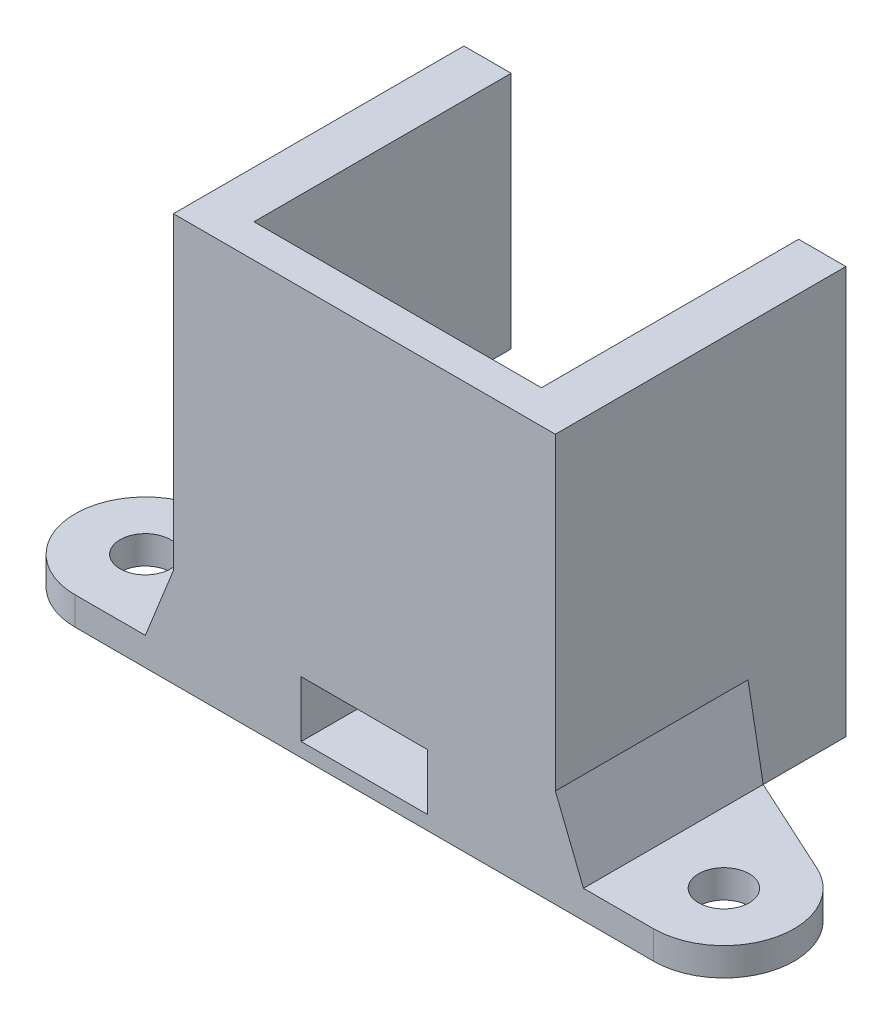
ISO-10303-21;
HEADER;
FILE_DESCRIPTION(('STEP AP214'),'2;1');
FILE_NAME('part.step','',(''),(''),'','','');
FILE_SCHEMA(('AUTOMOTIVE_DESIGN { 1 0 10303 214 1 1 1 1 }'));
ENDSEC;
DATA;
#1=APPLICATION_CONTEXT('core data for automotive mechanical design processes');
#2=APPLICATION_PROTOCOL_DEFINITION('international standard','automotive_design',2000,#1);
#3=PRODUCT_CONTEXT('',#1,'mechanical');
#4=PRODUCT('Part','Part','',(#3));
#5=PRODUCT_RELATED_PRODUCT_CATEGORY('part','',(#4));
#6=PRODUCT_DEFINITION_FORMATION('','',#4);
#7=PRODUCT_DEFINITION_CONTEXT('part definition',#1,'design');
#8=PRODUCT_DEFINITION('design','',#6,#7);
#9=PRODUCT_DEFINITION_SHAPE('','',#8);
#10=(LENGTH_UNIT() NAMED_UNIT(*) SI_UNIT(.MILLI.,.METRE.));
#11=(NAMED_UNIT(*) PLANE_ANGLE_UNIT() SI_UNIT($,.RADIAN.));
#12=(NAMED_UNIT(*) SI_UNIT($,.STERADIAN.) SOLID_ANGLE_UNIT());
#13=UNCERTAINTY_MEASURE_WITH_UNIT(LENGTH_MEASURE(1.E-05),#10,'distance_accuracy_value','');
#14=(GEOMETRIC_REPRESENTATION_CONTEXT(3) GLOBAL_UNCERTAINTY_ASSIGNED_CONTEXT((#13)) GLOBAL_UNIT_ASSIGNED_CONTEXT((#10,
#11,#12)) REPRESENTATION_CONTEXT('',''));
#15=CARTESIAN_POINT('',(0.,0.,0.));
#16=DIRECTION('',(0.,0.,1.));
#17=DIRECTION('',(1.,0.,0.));
#18=AXIS2_PLACEMENT_3D('',#15,#16,#17);
#19=CARTESIAN_POINT('',(0.,0.,0.234999999999994));
#20=DIRECTION('',(0.,0.,1.));
#21=DIRECTION('',(1.,0.,0.));
#22=AXIS2_PLACEMENT_3D('',#19,#20,#21);
#23=PLANE('',#22);
#24=DIRECTION('',(0.,-1.,0.));
#25=VECTOR('',#24,1.);
#26=CARTESIAN_POINT('',(-17.27,10.16,0.234999999999996));
#27=LINE('',#26,#25);
#28=CARTESIAN_POINT('',(-17.27,36.83,0.234999999999985));
#29=VERTEX_POINT('',#28);
#30=CARTESIAN_POINT('',(-17.27,0.,0.234999999999989));
#31=VERTEX_POINT('',#30);
#32=EDGE_CURVE('E395',#29,#31,#27,.T.);
#33=ORIENTED_EDGE('',*,*,#32,.F.);
#34=DIRECTION('',(1.,0.,0.));
#35=VECTOR('',#34,1.);
#36=CARTESIAN_POINT('',(0.,36.83,0.234999999999994));
#37=LINE('',#36,#35);
#38=CARTESIAN_POINT('',(-13.,36.83,0.234999999999985));
#39=VERTEX_POINT('',#38);
#40=EDGE_CURVE('E383',#29,#39,#37,.T.);
#41=ORIENTED_EDGE('',*,*,#40,.T.);
#42=DIRECTION('',(0.,-1.,0.));
#43=VECTOR('',#42,1.);
#44=CARTESIAN_POINT('',(-13.,36.83,0.234999999999992));
#45=LINE('',#44,#43);
#46=CARTESIAN_POINT('',(-13.,15.24,0.234999999999985));
#47=VERTEX_POINT('',#46);
#48=EDGE_CURVE('E42',#39,#47,#45,.T.);
#49=ORIENTED_EDGE('',*,*,#48,.T.);
#50=DIRECTION('',(1.,0.,0.));
#51=VECTOR('',#50,1.);
#52=CARTESIAN_POINT('',(0.,15.24,0.234999999999994));
#53=LINE('',#52,#51);
#54=CARTESIAN_POINT('',(-16.,15.24,0.234999999999992));
#55=VERTEX_POINT('',#54);
#56=EDGE_CURVE('E379',#55,#47,#53,.T.);
#57=ORIENTED_EDGE('',*,*,#56,.F.);
#58=DIRECTION('',(0.,-1.,0.));
#59=VECTOR('',#58,1.);
#60=CARTESIAN_POINT('',(-16.,15.24,0.234999999999992));
#61=LINE('',#60,#59);
#62=CARTESIAN_POINT('',(-16.,10.16,0.234999999999992));
#63=VERTEX_POINT('',#62);
#64=EDGE_CURVE('E387',#55,#63,#61,.T.);
#65=ORIENTED_EDGE('',*,*,#64,.T.);
#66=DIRECTION('',(1.,0.,0.));
#67=VECTOR('',#66,1.);
#68=CARTESIAN_POINT('',(0.,10.16,0.234999999999994));
#69=LINE('',#68,#67);
#70=CARTESIAN_POINT('',(-11.2395,10.16,0.234999999999996));
#71=VERTEX_POINT('',#70);
#72=EDGE_CURVE('E392',#63,#71,#69,.T.);
#73=ORIENTED_EDGE('',*,*,#72,.T.);
#74=DIRECTION('',(0.,-1.,0.));
#75=VECTOR('',#74,1.);
#76=CARTESIAN_POINT('',(-11.2395,10.16,0.234999999999996));
#77=LINE('',#76,#75);
#78=CARTESIAN_POINT('',(-11.2395,0.,0.234999999999996));
#79=VERTEX_POINT('',#78);
#80=EDGE_CURVE('E37',#71,#79,#77,.T.);
#81=ORIENTED_EDGE('',*,*,#80,.T.);
#82=DIRECTION('',(1.,0.,0.));
#83=VECTOR('',#82,1.);
#84=CARTESIAN_POINT('',(0.,0.,0.234999999999994));
#85=LINE('',#84,#83);
#86=EDGE_CURVE('E398',#31,#79,#85,.T.);
#87=ORIENTED_EDGE('',*,*,#86,.F.);
#88=EDGE_LOOP('',(#33,#41,#49,#57,#65,#73,#81,#87));
#89=FACE_BOUND('',#88,.T.);
#90=ADVANCED_FACE('F34',(#89),#23,.F.);
#91=DIRECTION('',(0.,1.,0.));
#92=VECTOR('',#91,1.);
#93=CARTESIAN_POINT('',(11.2395,10.16,0.234999999999996));
#94=LINE('',#93,#92);
#95=CARTESIAN_POINT('',(11.2395,0.,0.234999999999996));
#96=VERTEX_POINT('',#95);
#97=CARTESIAN_POINT('',(11.2395,10.16,0.234999999999996));
#98=VERTEX_POINT('',#97);
#99=EDGE_CURVE('E391',#96,#98,#94,.T.);
#100=ORIENTED_EDGE('',*,*,#99,.T.);
#101=CARTESIAN_POINT('',(16.,10.16,0.234999999999992));
#102=VERTEX_POINT('',#101);
#103=EDGE_CURVE('E388',#98,#102,#69,.T.);
#104=ORIENTED_EDGE('',*,*,#103,.T.);
#105=DIRECTION('',(0.,1.,0.));
#106=VECTOR('',#105,1.);
#107=CARTESIAN_POINT('',(16.,15.24,0.234999999999992));
#108=LINE('',#107,#106);
#109=CARTESIAN_POINT('',(16.,15.24,0.234999999999992));
#110=VERTEX_POINT('',#109);
#111=EDGE_CURVE('E384',#102,#110,#108,.T.);
#112=ORIENTED_EDGE('',*,*,#111,.T.);
#113=CARTESIAN_POINT('',(13.,15.24,0.234999999999985));
#114=VERTEX_POINT('',#113);
#115=EDGE_CURVE('E240',#114,#110,#53,.T.);
#116=ORIENTED_EDGE('',*,*,#115,.F.);
#117=DIRECTION('',(0.,1.,0.));
#118=VECTOR('',#117,1.);
#119=CARTESIAN_POINT('',(13.,36.83,0.234999999999992));
#120=LINE('',#119,#118);
#121=CARTESIAN_POINT('',(13.,36.83,0.234999999999985));
#122=VERTEX_POINT('',#121);
#123=EDGE_CURVE('E11',#114,#122,#120,.T.);
#124=ORIENTED_EDGE('',*,*,#123,.T.);
#125=CARTESIAN_POINT('',(17.27,36.83,0.234999999999985));
#126=VERTEX_POINT('',#125);
#127=EDGE_CURVE('E56',#122,#126,#37,.T.);
#128=ORIENTED_EDGE('',*,*,#127,.T.);
#129=DIRECTION('',(0.,1.,0.));
#130=VECTOR('',#129,1.);
#131=CARTESIAN_POINT('',(17.27,10.16,0.234999999999992));
#132=LINE('',#131,#130);
#133=CARTESIAN_POINT('',(17.27,0.,0.234999999999985));
#134=VERTEX_POINT('',#133);
#135=EDGE_CURVE('E393',#134,#126,#132,.T.);
#136=ORIENTED_EDGE('',*,*,#135,.F.);
#137=EDGE_CURVE('E381',#96,#134,#85,.T.);
#138=ORIENTED_EDGE('',*,*,#137,.F.);
#139=EDGE_LOOP('',(#100,#104,#112,#116,#124,#128,#136,#138));
#140=FACE_BOUND('',#139,.T.);
#141=ADVANCED_FACE('F485',(#140),#23,.F.);
#142=CARTESIAN_POINT('',(17.27,10.16,-26.035));
#143=DIRECTION('',(-1.,0.,0.));
#144=DIRECTION('',(0.,0.,1.));
#145=AXIS2_PLACEMENT_3D('',#142,#143,#144);
#146=PLANE('',#145);
#147=DIRECTION('',(0.,0.,-1.));
#148=VECTOR('',#147,1.);
#149=CARTESIAN_POINT('',(17.27,0.,-26.035));
#150=LINE('',#149,#148);
#151=CARTESIAN_POINT('',(17.27,0.,9.08339668340667));
#152=VERTEX_POINT('',#151);
#153=EDGE_CURVE('E359',#152,#134,#150,.T.);
#154=ORIENTED_EDGE('',*,*,#153,.T.);
#155=ORIENTED_EDGE('',*,*,#135,.T.);
#156=DIRECTION('',(0.,0.,-1.));
#157=VECTOR('',#156,1.);
#158=CARTESIAN_POINT('',(17.27,36.83,-26.035));
#159=LINE('',#158,#157);
#160=CARTESIAN_POINT('',(17.27,36.83,26.505));
#161=VERTEX_POINT('',#160);
#162=EDGE_CURVE('E311',#161,#126,#159,.T.);
#163=ORIENTED_EDGE('',*,*,#162,.F.);
#164=DIRECTION('',(0.,-1.,0.));
#165=VECTOR('',#164,1.);
#166=CARTESIAN_POINT('',(17.27,10.16,26.505));
#167=LINE('',#166,#165);
#168=CARTESIAN_POINT('',(17.27,8.89,26.505));
#169=VERTEX_POINT('',#168);
#170=EDGE_CURVE('E362',#161,#169,#167,.T.);
#171=ORIENTED_EDGE('',*,*,#170,.T.);
#172=DIRECTION('',(0.,0.,1.));
#173=VECTOR('',#172,1.);
#174=CARTESIAN_POINT('',(17.27,8.89,9.083396794));
#175=LINE('',#174,#173);
#176=CARTESIAN_POINT('',(17.27,8.89,9.083396794));
#177=VERTEX_POINT('',#176);
#178=EDGE_CURVE('E427',#177,#169,#175,.T.);
#179=ORIENTED_EDGE('',*,*,#178,.F.);
#180=DIRECTION('',(0.,-1.,0.));
#181=VECTOR('',#180,1.);
#182=CARTESIAN_POINT('',(17.27,2.54,9.08339668340669));
#183=LINE('',#182,#181);
#184=EDGE_CURVE('E457',#177,#152,#183,.T.);
#185=ORIENTED_EDGE('',*,*,#184,.T.);
#186=EDGE_LOOP('',(#154,#155,#163,#171,#179,#185));
#187=FACE_BOUND('',#186,.T.);
#188=ADVANCED_FACE('F489',(#187),#146,.F.);
#189=CARTESIAN_POINT('',(-17.27,8.89,9.083396794));
#190=DIRECTION('',(0.928476690885261,-0.371390676354101,0.));
#191=DIRECTION('',(0.371390676354101,0.928476690885261,0.));
#192=AXIS2_PLACEMENT_3D('',#189,#190,#191);
#193=PLANE('',#192);
#194=DIRECTION('',(0.366101243764277,0.915253109410701,-0.168171415610062));
#195=VECTOR('',#194,1.);
#196=CARTESIAN_POINT('',(-17.27,8.89,9.08339679400001));
#197=LINE('',#196,#195);
#198=CARTESIAN_POINT('',(-19.81,2.54,10.2501652847528));
#199=VERTEX_POINT('',#198);
#200=CARTESIAN_POINT('',(-17.27,8.89,9.083396794));
#201=VERTEX_POINT('',#200);
#202=EDGE_CURVE('E222',#199,#201,#197,.T.);
#203=ORIENTED_EDGE('',*,*,#202,.F.);
#204=DIRECTION('',(0.,0.,-1.));
#205=VECTOR('',#204,1.);
#206=CARTESIAN_POINT('',(-19.81,2.54,0.));
#207=LINE('',#206,#205);
#208=CARTESIAN_POINT('',(-19.81,2.54,26.505));
#209=VERTEX_POINT('',#208);
#210=EDGE_CURVE('E226',#209,#199,#207,.T.);
#211=ORIENTED_EDGE('',*,*,#210,.F.);
#212=DIRECTION('',(0.371390676354101,0.928476690885261,0.));
#213=VECTOR('',#212,1.);
#214=CARTESIAN_POINT('',(-17.27,8.89,26.505));
#215=LINE('',#214,#213);
#216=CARTESIAN_POINT('',(-17.27,8.89,26.505));
#217=VERTEX_POINT('',#216);
#218=EDGE_CURVE('E232',#209,#217,#215,.T.);
#219=ORIENTED_EDGE('',*,*,#218,.T.);
#220=DIRECTION('',(0.,0.,1.));
#221=VECTOR('',#220,1.);
#222=CARTESIAN_POINT('',(-17.27,8.89,9.083396794));
#223=LINE('',#222,#221);
#224=EDGE_CURVE('E228',#201,#217,#223,.T.);
#225=ORIENTED_EDGE('',*,*,#224,.F.);
#226=EDGE_LOOP('',(#203,#211,#219,#225));
#227=FACE_BOUND('',#226,.T.);
#228=ADVANCED_FACE('F224',(#227),#193,.F.);
#229=CARTESIAN_POINT('',(-17.27,10.16,-26.035));
#230=DIRECTION('',(1.,0.,0.));
#231=DIRECTION('',(0.,0.,-1.));
#232=AXIS2_PLACEMENT_3D('',#229,#230,#231);
#233=PLANE('',#232);
#234=DIRECTION('',(0.,0.,1.));
#235=VECTOR('',#234,1.);
#236=CARTESIAN_POINT('',(-17.27,36.83,-26.035));
#237=LINE('',#236,#235);
#238=CARTESIAN_POINT('',(-17.27,36.83,26.505));
#239=VERTEX_POINT('',#238);
#240=EDGE_CURVE('E306',#29,#239,#237,.T.);
#241=ORIENTED_EDGE('',*,*,#240,.F.);
#242=ORIENTED_EDGE('',*,*,#32,.T.);
#243=DIRECTION('',(0.,0.,1.));
#244=VECTOR('',#243,1.);
#245=CARTESIAN_POINT('',(-17.27,0.,-26.035));
#246=LINE('',#245,#244);
#247=CARTESIAN_POINT('',(-17.27,0.,9.08339668340668));
#248=VERTEX_POINT('',#247);
#249=EDGE_CURVE('E355',#31,#248,#246,.T.);
#250=ORIENTED_EDGE('',*,*,#249,.T.);
#251=DIRECTION('',(0.,-1.,0.));
#252=VECTOR('',#251,1.);
#253=CARTESIAN_POINT('',(-17.27,2.54,9.08339668340669));
#254=LINE('',#253,#252);
#255=EDGE_CURVE('E259',#201,#248,#254,.T.);
#256=ORIENTED_EDGE('',*,*,#255,.F.);
#257=ORIENTED_EDGE('',*,*,#224,.T.);
#258=DIRECTION('',(0.,-1.,0.));
#259=VECTOR('',#258,1.);
#260=CARTESIAN_POINT('',(-17.27,10.16,26.505));
#261=LINE('',#260,#259);
#262=EDGE_CURVE('E365',#239,#217,#261,.T.);
#263=ORIENTED_EDGE('',*,*,#262,.F.);
#264=EDGE_LOOP('',(#241,#242,#250,#256,#257,#263));
#265=FACE_BOUND('',#264,.T.);
#266=ADVANCED_FACE('F408',(#265),#233,.F.);
#267=CARTESIAN_POINT('',(0.,2.54,0.));
#268=DIRECTION('',(0.,1.,0.));
#269=DIRECTION('',(0.,0.,1.));
#270=AXIS2_PLACEMENT_3D('',#267,#268,#269);
#271=PLANE('',#270);
#272=CARTESIAN_POINT('',(-26.16,2.54,20.155));
#273=DIRECTION('',(0.,1.,0.));
#274=DIRECTION('',(0.,0.,1.));
#275=AXIS2_PLACEMENT_3D('',#272,#273,#274);
#276=CIRCLE('',#275,2.286);
#277=CARTESIAN_POINT('',(-26.16,2.54,22.441));
#278=VERTEX_POINT('',#277);
#279=EDGE_CURVE('E429',#278,#278,#276,.T.);
#280=ORIENTED_EDGE('',*,*,#279,.F.);
#281=EDGE_LOOP('',(#280));
#282=FACE_BOUND('',#281,.T.);
#283=DIRECTION('',(1.,0.,0.));
#284=VECTOR('',#283,1.);
#285=CARTESIAN_POINT('',(0.,2.54,26.5049999999999));
#286=LINE('',#285,#284);
#287=CARTESIAN_POINT('',(-26.16,2.54,26.505));
#288=VERTEX_POINT('',#287);
#289=EDGE_CURVE('E239',#288,#209,#286,.T.);
#290=ORIENTED_EDGE('',*,*,#289,.T.);
#291=ORIENTED_EDGE('',*,*,#210,.T.);
#292=DIRECTION('',(0.908711915483254,0.,-0.417423830966509));
#293=VECTOR('',#292,1.);
#294=CARTESIAN_POINT('',(0.436325299004207,2.54,0.949859516438888));
#295=LINE('',#294,#293);
#296=CARTESIAN_POINT('',(-28.8106413266373,2.54,14.3846793366814));
#297=VERTEX_POINT('',#296);
#298=EDGE_CURVE('E237',#297,#199,#295,.T.);
#299=ORIENTED_EDGE('',*,*,#298,.F.);
#300=CARTESIAN_POINT('',(-26.16,2.54,20.155));
#301=DIRECTION('',(0.,1.,0.));
#302=DIRECTION('',(0.,0.,1.));
#303=AXIS2_PLACEMENT_3D('',#300,#301,#302);
#304=CIRCLE('',#303,6.34999999999999);
#305=EDGE_CURVE('E247',#297,#288,#304,.T.);
#306=ORIENTED_EDGE('',*,*,#305,.T.);
#307=EDGE_LOOP('',(#290,#291,#299,#306));
#308=FACE_BOUND('',#307,.T.);
#309=ADVANCED_FACE('F236',(#282,#308),#271,.T.);
#310=CARTESIAN_POINT('',(0.,10.16,0.));
#311=DIRECTION('',(0.,1.,0.));
#312=DIRECTION('',(0.,0.,1.));
#313=AXIS2_PLACEMENT_3D('',#310,#311,#312);
#314=PLANE('',#313);
#315=ORIENTED_EDGE('',*,*,#72,.F.);
#316=DIRECTION('',(0.,0.,1.));
#317=VECTOR('',#316,1.);
#318=CARTESIAN_POINT('',(-16.,10.16,-24.765));
#319=LINE('',#318,#317);
#320=CARTESIAN_POINT('',(-16.,10.16,25.235));
#321=VERTEX_POINT('',#320);
#322=EDGE_CURVE('E313',#63,#321,#319,.T.);
#323=ORIENTED_EDGE('',*,*,#322,.T.);
#324=DIRECTION('',(1.,0.,0.));
#325=VECTOR('',#324,1.);
#326=CARTESIAN_POINT('',(-16.,10.16,25.235));
#327=LINE('',#326,#325);
#328=CARTESIAN_POINT('',(16.,10.16,25.235));
#329=VERTEX_POINT('',#328);
#330=EDGE_CURVE('E325',#321,#329,#327,.T.);
#331=ORIENTED_EDGE('',*,*,#330,.T.);
#332=DIRECTION('',(0.,0.,-1.));
#333=VECTOR('',#332,1.);
#334=CARTESIAN_POINT('',(16.,10.16,-24.765));
#335=LINE('',#334,#333);
#336=EDGE_CURVE('E317',#329,#102,#335,.T.);
#337=ORIENTED_EDGE('',*,*,#336,.T.);
#338=ORIENTED_EDGE('',*,*,#103,.F.);
#339=DIRECTION('',(0.,0.,-1.));
#340=VECTOR('',#339,1.);
#341=CARTESIAN_POINT('',(11.2395,10.16,19.05));
#342=LINE('',#341,#340);
#343=CARTESIAN_POINT('',(11.2395,10.16,19.05));
#344=VERTEX_POINT('',#343);
#345=EDGE_CURVE('E335',#344,#98,#342,.T.);
#346=ORIENTED_EDGE('',*,*,#345,.F.);
#347=DIRECTION('',(1.,0.,0.));
#348=VECTOR('',#347,1.);
#349=CARTESIAN_POINT('',(-11.2395,10.16,19.05));
#350=LINE('',#349,#348);
#351=CARTESIAN_POINT('',(-11.2395,10.16,19.05));
#352=VERTEX_POINT('',#351);
#353=EDGE_CURVE('E341',#352,#344,#350,.T.);
#354=ORIENTED_EDGE('',*,*,#353,.F.);
#355=DIRECTION('',(0.,0.,1.));
#356=VECTOR('',#355,1.);
#357=CARTESIAN_POINT('',(-11.2395,10.16,19.05));
#358=LINE('',#357,#356);
#359=EDGE_CURVE('E338',#71,#352,#358,.T.);
#360=ORIENTED_EDGE('',*,*,#359,.F.);
#361=EDGE_LOOP('',(#315,#323,#331,#337,#338,#346,#354,#360));
#362=FACE_BOUND('',#361,.T.);
#363=ADVANCED_FACE('F518',(#362),#314,.T.);
#364=CARTESIAN_POINT('',(0.,0.,0.));
#365=DIRECTION('',(0.,1.,0.));
#366=DIRECTION('',(0.,0.,1.));
#367=AXIS2_PLACEMENT_3D('',#364,#365,#366);
#368=PLANE('',#367);
#369=CARTESIAN_POINT('',(26.16,0.,20.155));
#370=DIRECTION('',(0.,1.,0.));
#371=DIRECTION('',(0.,0.,1.));
#372=AXIS2_PLACEMENT_3D('',#369,#370,#371);
#373=CIRCLE('',#372,2.286);
#374=CARTESIAN_POINT('',(26.16,0.,22.441));
#375=VERTEX_POINT('',#374);
#376=EDGE_CURVE('E433',#375,#375,#373,.F.);
#377=ORIENTED_EDGE('',*,*,#376,.F.);
#378=EDGE_LOOP('',(#377));
#379=FACE_BOUND('',#378,.T.);
#380=CARTESIAN_POINT('',(-26.16,0.,20.155));
#381=DIRECTION('',(0.,1.,0.));
#382=DIRECTION('',(0.,0.,1.));
#383=AXIS2_PLACEMENT_3D('',#380,#381,#382);
#384=CIRCLE('',#383,2.286);
#385=CARTESIAN_POINT('',(-26.16,0.,22.441));
#386=VERTEX_POINT('',#385);
#387=EDGE_CURVE('E434',#386,#386,#384,.F.);
#388=ORIENTED_EDGE('',*,*,#387,.F.);
#389=EDGE_LOOP('',(#388));
#390=FACE_BOUND('',#389,.T.);
#391=ORIENTED_EDGE('',*,*,#249,.F.);
#392=ORIENTED_EDGE('',*,*,#86,.T.);
#393=DIRECTION('',(0.,0.,1.));
#394=VECTOR('',#393,1.);
#395=CARTESIAN_POINT('',(-11.2395,0.,19.05));
#396=LINE('',#395,#394);
#397=CARTESIAN_POINT('',(-11.2395,0.,19.05));
#398=VERTEX_POINT('',#397);
#399=EDGE_CURVE('E346',#79,#398,#396,.T.);
#400=ORIENTED_EDGE('',*,*,#399,.T.);
#401=DIRECTION('',(1.,0.,0.));
#402=VECTOR('',#401,1.);
#403=CARTESIAN_POINT('',(-11.2395,0.,19.05));
#404=LINE('',#403,#402);
#405=CARTESIAN_POINT('',(11.2395,0.,19.05));
#406=VERTEX_POINT('',#405);
#407=EDGE_CURVE('E339',#398,#406,#404,.T.);
#408=ORIENTED_EDGE('',*,*,#407,.T.);
#409=DIRECTION('',(0.,0.,-1.));
#410=VECTOR('',#409,1.);
#411=CARTESIAN_POINT('',(11.2395,0.,19.05));
#412=LINE('',#411,#410);
#413=EDGE_CURVE('E334',#406,#96,#412,.T.);
#414=ORIENTED_EDGE('',*,*,#413,.T.);
#415=ORIENTED_EDGE('',*,*,#137,.T.);
#416=ORIENTED_EDGE('',*,*,#153,.F.);
#417=DIRECTION('',(-0.908711915483254,0.,-0.417423830966508));
#418=VECTOR('',#417,1.);
#419=CARTESIAN_POINT('',(-0.436325299004206,0.,0.949859516438887));
#420=LINE('',#419,#418);
#421=CARTESIAN_POINT('',(28.8106413266373,0.,14.3846793366813));
#422=VERTEX_POINT('',#421);
#423=EDGE_CURVE('E446',#422,#152,#420,.T.);
#424=ORIENTED_EDGE('',*,*,#423,.F.);
#425=CARTESIAN_POINT('',(26.16,0.,20.155));
#426=DIRECTION('',(0.,1.,0.));
#427=DIRECTION('',(0.,0.,1.));
#428=AXIS2_PLACEMENT_3D('',#425,#426,#427);
#429=CIRCLE('',#428,6.34999999999999);
#430=CARTESIAN_POINT('',(26.16,0.,26.505));
#431=VERTEX_POINT('',#430);
#432=EDGE_CURVE('E437',#422,#431,#429,.F.);
#433=ORIENTED_EDGE('',*,*,#432,.T.);
#434=DIRECTION('',(1.,0.,0.));
#435=VECTOR('',#434,1.);
#436=CARTESIAN_POINT('',(-17.27,0.,26.505));
#437=LINE('',#436,#435);
#438=CARTESIAN_POINT('',(-26.16,0.,26.505));
#439=VERTEX_POINT('',#438);
#440=EDGE_CURVE('E357',#439,#431,#437,.T.);
#441=ORIENTED_EDGE('',*,*,#440,.F.);
#442=CARTESIAN_POINT('',(-26.16,0.,20.155));
#443=DIRECTION('',(0.,1.,0.));
#444=DIRECTION('',(0.,0.,1.));
#445=AXIS2_PLACEMENT_3D('',#442,#443,#444);
#446=CIRCLE('',#445,6.34999999999999);
#447=CARTESIAN_POINT('',(-28.8106413266373,0.,14.3846793366814));
#448=VERTEX_POINT('',#447);
#449=EDGE_CURVE('E248',#448,#439,#446,.T.);
#450=ORIENTED_EDGE('',*,*,#449,.F.);
#451=DIRECTION('',(0.908711915483254,0.,-0.417423830966509));
#452=VECTOR('',#451,1.);
#453=CARTESIAN_POINT('',(0.436325299004207,0.,0.949859516438888));
#454=LINE('',#453,#452);
#455=EDGE_CURVE('E252',#448,#248,#454,.T.);
#456=ORIENTED_EDGE('',*,*,#455,.T.);
#457=EDGE_LOOP('',(#391,#392,#400,#408,#414,#415,#416,#424,#433,#441,#450,#456));
#458=FACE_BOUND('',#457,.T.);
#459=ADVANCED_FACE('F413',(#379,#390,#458),#368,.F.);
#460=CARTESIAN_POINT('',(-17.27,10.16,26.505));
#461=DIRECTION('',(0.,0.,-1.));
#462=DIRECTION('',(-1.,0.,0.));
#463=AXIS2_PLACEMENT_3D('',#460,#461,#462);
#464=PLANE('',#463);
#465=DIRECTION('',(1.,0.,0.));
#466=VECTOR('',#465,1.);
#467=CARTESIAN_POINT('',(-5.715,1.27,26.505));
#468=LINE('',#467,#466);
#469=CARTESIAN_POINT('',(-5.715,1.27,26.505));
#470=VERTEX_POINT('',#469);
#471=CARTESIAN_POINT('',(5.715,1.27,26.505));
#472=VERTEX_POINT('',#471);
#473=EDGE_CURVE('E269',#470,#472,#468,.T.);
#474=ORIENTED_EDGE('',*,*,#473,.F.);
#475=DIRECTION('',(0.,-1.,0.));
#476=VECTOR('',#475,1.);
#477=CARTESIAN_POINT('',(-5.715,1.27,26.505));
#478=LINE('',#477,#476);
#479=CARTESIAN_POINT('',(-5.715,6.35,26.505));
#480=VERTEX_POINT('',#479);
#481=EDGE_CURVE('E267',#480,#470,#478,.T.);
#482=ORIENTED_EDGE('',*,*,#481,.F.);
#483=DIRECTION('',(-1.,0.,0.));
#484=VECTOR('',#483,1.);
#485=CARTESIAN_POINT('',(-5.715,6.35,26.505));
#486=LINE('',#485,#484);
#487=CARTESIAN_POINT('',(5.715,6.35,26.505));
#488=VERTEX_POINT('',#487);
#489=EDGE_CURVE('E275',#488,#480,#486,.T.);
#490=ORIENTED_EDGE('',*,*,#489,.F.);
#491=DIRECTION('',(0.,1.,0.));
#492=VECTOR('',#491,1.);
#493=CARTESIAN_POINT('',(5.715,1.27,26.505));
#494=LINE('',#493,#492);
#495=EDGE_CURVE('E272',#472,#488,#494,.T.);
#496=ORIENTED_EDGE('',*,*,#495,.F.);
#497=EDGE_LOOP('',(#474,#482,#490,#496));
#498=FACE_BOUND('',#497,.T.);
#499=ORIENTED_EDGE('',*,*,#440,.T.);
#500=DIRECTION('',(0.,-1.,0.));
#501=VECTOR('',#500,1.);
#502=CARTESIAN_POINT('',(26.16,2.54,26.505));
#503=LINE('',#502,#501);
#504=CARTESIAN_POINT('',(26.16,2.54,26.505));
#505=VERTEX_POINT('',#504);
#506=EDGE_CURVE('E452',#505,#431,#503,.T.);
#507=ORIENTED_EDGE('',*,*,#506,.F.);
#508=DIRECTION('',(-1.,0.,0.));
#509=VECTOR('',#508,1.);
#510=CARTESIAN_POINT('',(0.,2.54,26.505));
#511=LINE('',#510,#509);
#512=CARTESIAN_POINT('',(19.81,2.54,26.505));
#513=VERTEX_POINT('',#512);
#514=EDGE_CURVE('E449',#505,#513,#511,.T.);
#515=ORIENTED_EDGE('',*,*,#514,.T.);
#516=DIRECTION('',(-0.371390676354101,0.928476690885261,0.));
#517=VECTOR('',#516,1.);
#518=CARTESIAN_POINT('',(17.27,8.89,26.505));
#519=LINE('',#518,#517);
#520=EDGE_CURVE('E424',#513,#169,#519,.T.);
#521=ORIENTED_EDGE('',*,*,#520,.T.);
#522=ORIENTED_EDGE('',*,*,#170,.F.);
#523=DIRECTION('',(1.,0.,0.));
#524=VECTOR('',#523,1.);
#525=CARTESIAN_POINT('',(-17.27,36.83,26.505));
#526=LINE('',#525,#524);
#527=EDGE_CURVE('E308',#239,#161,#526,.T.);
#528=ORIENTED_EDGE('',*,*,#527,.F.);
#529=ORIENTED_EDGE('',*,*,#262,.T.);
#530=ORIENTED_EDGE('',*,*,#218,.F.);
#531=ORIENTED_EDGE('',*,*,#289,.F.);
#532=DIRECTION('',(0.,-1.,0.));
#533=VECTOR('',#532,1.);
#534=CARTESIAN_POINT('',(-26.16,2.54,26.505));
#535=LINE('',#534,#533);
#536=EDGE_CURVE('E263',#288,#439,#535,.T.);
#537=ORIENTED_EDGE('',*,*,#536,.T.);
#538=EDGE_LOOP('',(#499,#507,#515,#521,#522,#528,#529,#530,#531,#537));
#539=FACE_BOUND('',#538,.T.);
#540=ADVANCED_FACE('F420',(#498,#539),#464,.F.);
#541=CARTESIAN_POINT('',(11.2395,10.16,19.05));
#542=DIRECTION('',(-1.,0.,0.));
#543=DIRECTION('',(0.,0.,1.));
#544=AXIS2_PLACEMENT_3D('',#541,#542,#543);
#545=PLANE('',#544);
#546=ORIENTED_EDGE('',*,*,#99,.F.);
#547=ORIENTED_EDGE('',*,*,#413,.F.);
#548=DIRECTION('',(0.,-1.,0.));
#549=VECTOR('',#548,1.);
#550=CARTESIAN_POINT('',(11.2395,10.16,19.05));
#551=LINE('',#550,#549);
#552=EDGE_CURVE('E343',#344,#406,#551,.T.);
#553=ORIENTED_EDGE('',*,*,#552,.F.);
#554=ORIENTED_EDGE('',*,*,#345,.T.);
#555=EDGE_LOOP('',(#546,#547,#553,#554));
#556=FACE_BOUND('',#555,.T.);
#557=ADVANCED_FACE('F533',(#556),#545,.T.);
#558=CARTESIAN_POINT('',(-11.2395,10.16,19.05));
#559=DIRECTION('',(1.,0.,0.));
#560=DIRECTION('',(0.,0.,-1.));
#561=AXIS2_PLACEMENT_3D('',#558,#559,#560);
#562=PLANE('',#561);
#563=ORIENTED_EDGE('',*,*,#80,.F.);
#564=ORIENTED_EDGE('',*,*,#359,.T.);
#565=DIRECTION('',(0.,-1.,0.));
#566=VECTOR('',#565,1.);
#567=CARTESIAN_POINT('',(-11.2395,10.16,19.05));
#568=LINE('',#567,#566);
#569=EDGE_CURVE('E352',#352,#398,#568,.T.);
#570=ORIENTED_EDGE('',*,*,#569,.T.);
#571=ORIENTED_EDGE('',*,*,#399,.F.);
#572=EDGE_LOOP('',(#563,#564,#570,#571));
#573=FACE_BOUND('',#572,.T.);
#574=ADVANCED_FACE('F541',(#573),#562,.T.);
#575=CARTESIAN_POINT('',(-11.2395,10.16,19.05));
#576=DIRECTION('',(0.,0.,-1.));
#577=DIRECTION('',(-1.,0.,0.));
#578=AXIS2_PLACEMENT_3D('',#575,#576,#577);
#579=PLANE('',#578);
#580=DIRECTION('',(0.,1.,0.));
#581=VECTOR('',#580,1.);
#582=CARTESIAN_POINT('',(-5.715,10.16,19.05));
#583=LINE('',#582,#581);
#584=CARTESIAN_POINT('',(-5.715,1.27,19.05));
#585=VERTEX_POINT('',#584);
#586=CARTESIAN_POINT('',(-5.715,6.35,19.05));
#587=VERTEX_POINT('',#586);
#588=EDGE_CURVE('E375',#585,#587,#583,.T.);
#589=ORIENTED_EDGE('',*,*,#588,.F.);
#590=DIRECTION('',(-1.,0.,0.));
#591=VECTOR('',#590,1.);
#592=CARTESIAN_POINT('',(-11.2395,1.27,19.05));
#593=LINE('',#592,#591);
#594=CARTESIAN_POINT('',(5.715,1.27,19.05));
#595=VERTEX_POINT('',#594);
#596=EDGE_CURVE('E368',#595,#585,#593,.T.);
#597=ORIENTED_EDGE('',*,*,#596,.F.);
#598=DIRECTION('',(0.,-1.,0.));
#599=VECTOR('',#598,1.);
#600=CARTESIAN_POINT('',(5.715,10.16,19.05));
#601=LINE('',#600,#599);
#602=CARTESIAN_POINT('',(5.715,6.35,19.05));
#603=VERTEX_POINT('',#602);
#604=EDGE_CURVE('E370',#603,#595,#601,.T.);
#605=ORIENTED_EDGE('',*,*,#604,.F.);
#606=DIRECTION('',(1.,0.,0.));
#607=VECTOR('',#606,1.);
#608=CARTESIAN_POINT('',(-11.2395,6.35,19.05));
#609=LINE('',#608,#607);
#610=EDGE_CURVE('E373',#587,#603,#609,.T.);
#611=ORIENTED_EDGE('',*,*,#610,.F.);
#612=EDGE_LOOP('',(#589,#597,#605,#611));
#613=FACE_BOUND('',#612,.T.);
#614=ORIENTED_EDGE('',*,*,#407,.F.);
#615=ORIENTED_EDGE('',*,*,#569,.F.);
#616=ORIENTED_EDGE('',*,*,#353,.T.);
#617=ORIENTED_EDGE('',*,*,#552,.T.);
#618=EDGE_LOOP('',(#614,#615,#616,#617));
#619=FACE_BOUND('',#618,.T.);
#620=ADVANCED_FACE('F545',(#613,#619),#579,.T.);
#621=CARTESIAN_POINT('',(-16.,15.24,-24.765));
#622=DIRECTION('',(1.,0.,0.));
#623=DIRECTION('',(0.,0.,-1.));
#624=AXIS2_PLACEMENT_3D('',#621,#622,#623);
#625=PLANE('',#624);
#626=ORIENTED_EDGE('',*,*,#64,.F.);
#627=DIRECTION('',(0.,0.,1.));
#628=VECTOR('',#627,1.);
#629=CARTESIAN_POINT('',(-16.,15.24,-24.765));
#630=LINE('',#629,#628);
#631=CARTESIAN_POINT('',(-16.,15.24,25.235));
#632=VERTEX_POINT('',#631);
#633=EDGE_CURVE('E314',#55,#632,#630,.T.);
#634=ORIENTED_EDGE('',*,*,#633,.T.);
#635=DIRECTION('',(0.,-1.,0.));
#636=VECTOR('',#635,1.);
#637=CARTESIAN_POINT('',(-16.,15.24,25.235));
#638=LINE('',#637,#636);
#639=EDGE_CURVE('E331',#632,#321,#638,.T.);
#640=ORIENTED_EDGE('',*,*,#639,.T.);
#641=ORIENTED_EDGE('',*,*,#322,.F.);
#642=EDGE_LOOP('',(#626,#634,#640,#641));
#643=FACE_BOUND('',#642,.T.);
#644=ADVANCED_FACE('F549',(#643),#625,.T.);
#645=CARTESIAN_POINT('',(-16.,15.24,25.235));
#646=DIRECTION('',(0.,0.,-1.));
#647=DIRECTION('',(-1.,0.,0.));
#648=AXIS2_PLACEMENT_3D('',#645,#646,#647);
#649=PLANE('',#648);
#650=ORIENTED_EDGE('',*,*,#330,.F.);
#651=ORIENTED_EDGE('',*,*,#639,.F.);
#652=DIRECTION('',(1.,0.,0.));
#653=VECTOR('',#652,1.);
#654=CARTESIAN_POINT('',(-16.,15.24,25.235));
#655=LINE('',#654,#653);
#656=CARTESIAN_POINT('',(16.,15.24,25.235));
#657=VERTEX_POINT('',#656);
#658=EDGE_CURVE('E316',#632,#657,#655,.T.);
#659=ORIENTED_EDGE('',*,*,#658,.T.);
#660=DIRECTION('',(0.,-1.,0.));
#661=VECTOR('',#660,1.);
#662=CARTESIAN_POINT('',(16.,15.24,25.235));
#663=LINE('',#662,#661);
#664=EDGE_CURVE('E323',#657,#329,#663,.T.);
#665=ORIENTED_EDGE('',*,*,#664,.T.);
#666=EDGE_LOOP('',(#650,#651,#659,#665));
#667=FACE_BOUND('',#666,.T.);
#668=ADVANCED_FACE('F553',(#667),#649,.T.);
#669=CARTESIAN_POINT('',(16.,15.24,-24.765));
#670=DIRECTION('',(-1.,0.,0.));
#671=DIRECTION('',(0.,0.,1.));
#672=AXIS2_PLACEMENT_3D('',#669,#670,#671);
#673=PLANE('',#672);
#674=ORIENTED_EDGE('',*,*,#111,.F.);
#675=ORIENTED_EDGE('',*,*,#336,.F.);
#676=ORIENTED_EDGE('',*,*,#664,.F.);
#677=DIRECTION('',(0.,0.,-1.));
#678=VECTOR('',#677,1.);
#679=CARTESIAN_POINT('',(16.,15.24,-24.765));
#680=LINE('',#679,#678);
#681=EDGE_CURVE('E320',#657,#110,#680,.T.);
#682=ORIENTED_EDGE('',*,*,#681,.T.);
#683=EDGE_LOOP('',(#674,#675,#676,#682));
#684=FACE_BOUND('',#683,.T.);
#685=ADVANCED_FACE('F557',(#684),#673,.T.);
#686=CARTESIAN_POINT('',(0.,36.83,0.));
#687=DIRECTION('',(0.,1.,0.));
#688=DIRECTION('',(0.,0.,1.));
#689=AXIS2_PLACEMENT_3D('',#686,#687,#688);
#690=PLANE('',#689);
#691=ORIENTED_EDGE('',*,*,#40,.F.);
#692=ORIENTED_EDGE('',*,*,#240,.T.);
#693=ORIENTED_EDGE('',*,*,#527,.T.);
#694=ORIENTED_EDGE('',*,*,#162,.T.);
#695=ORIENTED_EDGE('',*,*,#127,.F.);
#696=DIRECTION('',(0.,0.,-1.));
#697=VECTOR('',#696,1.);
#698=CARTESIAN_POINT('',(13.,36.83,-24.765));
#699=LINE('',#698,#697);
#700=CARTESIAN_POINT('',(13.,36.83,23.495));
#701=VERTEX_POINT('',#700);
#702=EDGE_CURVE('E293',#701,#122,#699,.T.);
#703=ORIENTED_EDGE('',*,*,#702,.F.);
#704=DIRECTION('',(1.,0.,0.));
#705=VECTOR('',#704,1.);
#706=CARTESIAN_POINT('',(-13.,36.83,23.495));
#707=LINE('',#706,#705);
#708=CARTESIAN_POINT('',(-13.,36.83,23.495));
#709=VERTEX_POINT('',#708);
#710=EDGE_CURVE('E290',#709,#701,#707,.T.);
#711=ORIENTED_EDGE('',*,*,#710,.F.);
#712=DIRECTION('',(0.,0.,1.));
#713=VECTOR('',#712,1.);
#714=CARTESIAN_POINT('',(-13.,36.83,-24.765));
#715=LINE('',#714,#713);
#716=EDGE_CURVE('E288',#39,#709,#715,.T.);
#717=ORIENTED_EDGE('',*,*,#716,.F.);
#718=EDGE_LOOP('',(#691,#692,#693,#694,#695,#703,#711,#717));
#719=FACE_BOUND('',#718,.T.);
#720=ADVANCED_FACE('F561',(#719),#690,.T.);
#721=CARTESIAN_POINT('',(0.,15.24,0.));
#722=DIRECTION('',(0.,1.,0.));
#723=DIRECTION('',(0.,0.,1.));
#724=AXIS2_PLACEMENT_3D('',#721,#722,#723);
#725=PLANE('',#724);
#726=ORIENTED_EDGE('',*,*,#633,.F.);
#727=ORIENTED_EDGE('',*,*,#56,.T.);
#728=DIRECTION('',(0.,0.,1.));
#729=VECTOR('',#728,1.);
#730=CARTESIAN_POINT('',(-13.,15.24,-24.765));
#731=LINE('',#730,#729);
#732=CARTESIAN_POINT('',(-13.,15.24,23.495));
#733=VERTEX_POINT('',#732);
#734=EDGE_CURVE('E281',#47,#733,#731,.T.);
#735=ORIENTED_EDGE('',*,*,#734,.T.);
#736=DIRECTION('',(1.,0.,0.));
#737=VECTOR('',#736,1.);
#738=CARTESIAN_POINT('',(-13.,15.24,23.495));
#739=LINE('',#738,#737);
#740=CARTESIAN_POINT('',(13.,15.24,23.495));
#741=VERTEX_POINT('',#740);
#742=EDGE_CURVE('E297',#733,#741,#739,.T.);
#743=ORIENTED_EDGE('',*,*,#742,.T.);
#744=DIRECTION('',(0.,0.,-1.));
#745=VECTOR('',#744,1.);
#746=CARTESIAN_POINT('',(13.,15.24,-24.765));
#747=LINE('',#746,#745);
#748=EDGE_CURVE('E291',#741,#114,#747,.T.);
#749=ORIENTED_EDGE('',*,*,#748,.T.);
#750=ORIENTED_EDGE('',*,*,#115,.T.);
#751=ORIENTED_EDGE('',*,*,#681,.F.);
#752=ORIENTED_EDGE('',*,*,#658,.F.);
#753=EDGE_LOOP('',(#726,#727,#735,#743,#749,#750,#751,#752));
#754=FACE_BOUND('',#753,.T.);
#755=ADVANCED_FACE('F563',(#754),#725,.F.);
#756=CARTESIAN_POINT('',(-13.,36.83,-24.765));
#757=DIRECTION('',(1.,0.,0.));
#758=DIRECTION('',(0.,0.,-1.));
#759=AXIS2_PLACEMENT_3D('',#756,#757,#758);
#760=PLANE('',#759);
#761=ORIENTED_EDGE('',*,*,#48,.F.);
#762=ORIENTED_EDGE('',*,*,#716,.T.);
#763=DIRECTION('',(0.,-1.,0.));
#764=VECTOR('',#763,1.);
#765=CARTESIAN_POINT('',(-13.,36.83,23.495));
#766=LINE('',#765,#764);
#767=EDGE_CURVE('E303',#709,#733,#766,.T.);
#768=ORIENTED_EDGE('',*,*,#767,.T.);
#769=ORIENTED_EDGE('',*,*,#734,.F.);
#770=EDGE_LOOP('',(#761,#762,#768,#769));
#771=FACE_BOUND('',#770,.T.);
#772=ADVANCED_FACE('F566',(#771),#760,.T.);
#773=CARTESIAN_POINT('',(-13.,36.83,23.495));
#774=DIRECTION('',(0.,0.,-1.));
#775=DIRECTION('',(-1.,0.,0.));
#776=AXIS2_PLACEMENT_3D('',#773,#774,#775);
#777=PLANE('',#776);
#778=ORIENTED_EDGE('',*,*,#742,.F.);
#779=ORIENTED_EDGE('',*,*,#767,.F.);
#780=ORIENTED_EDGE('',*,*,#710,.T.);
#781=DIRECTION('',(0.,-1.,0.));
#782=VECTOR('',#781,1.);
#783=CARTESIAN_POINT('',(13.,36.83,23.495));
#784=LINE('',#783,#782);
#785=EDGE_CURVE('E295',#701,#741,#784,.T.);
#786=ORIENTED_EDGE('',*,*,#785,.T.);
#787=EDGE_LOOP('',(#778,#779,#780,#786));
#788=FACE_BOUND('',#787,.T.);
#789=ADVANCED_FACE('F572',(#788),#777,.T.);
#790=CARTESIAN_POINT('',(13.,36.83,-24.765));
#791=DIRECTION('',(-1.,0.,0.));
#792=DIRECTION('',(0.,0.,1.));
#793=AXIS2_PLACEMENT_3D('',#790,#791,#792);
#794=PLANE('',#793);
#795=ORIENTED_EDGE('',*,*,#123,.F.);
#796=ORIENTED_EDGE('',*,*,#748,.F.);
#797=ORIENTED_EDGE('',*,*,#785,.F.);
#798=ORIENTED_EDGE('',*,*,#702,.T.);
#799=EDGE_LOOP('',(#795,#796,#797,#798));
#800=FACE_BOUND('',#799,.T.);
#801=ADVANCED_FACE('F576',(#800),#794,.T.);
#802=CARTESIAN_POINT('',(-5.715,1.27,-38.5430494082811));
#803=DIRECTION('',(0.,-1.,0.));
#804=DIRECTION('',(1.,0.,0.));
#805=AXIS2_PLACEMENT_3D('',#802,#803,#804);
#806=PLANE('',#805);
#807=ORIENTED_EDGE('',*,*,#596,.T.);
#808=DIRECTION('',(0.,0.,1.));
#809=VECTOR('',#808,1.);
#810=CARTESIAN_POINT('',(-5.715,1.27,-38.5430494082811));
#811=LINE('',#810,#809);
#812=EDGE_CURVE('E278',#585,#470,#811,.T.);
#813=ORIENTED_EDGE('',*,*,#812,.T.);
#814=ORIENTED_EDGE('',*,*,#473,.T.);
#815=DIRECTION('',(0.,0.,1.));
#816=VECTOR('',#815,1.);
#817=CARTESIAN_POINT('',(5.715,1.27,-38.5430494082811));
#818=LINE('',#817,#816);
#819=EDGE_CURVE('E284',#595,#472,#818,.T.);
#820=ORIENTED_EDGE('',*,*,#819,.F.);
#821=EDGE_LOOP('',(#807,#813,#814,#820));
#822=FACE_BOUND('',#821,.T.);
#823=ADVANCED_FACE('F580',(#822),#806,.F.);
#824=CARTESIAN_POINT('',(5.715,1.27,-38.5430494082811));
#825=DIRECTION('',(1.,0.,0.));
#826=DIRECTION('',(0.,0.,-1.));
#827=AXIS2_PLACEMENT_3D('',#824,#825,#826);
#828=PLANE('',#827);
#829=ORIENTED_EDGE('',*,*,#604,.T.);
#830=ORIENTED_EDGE('',*,*,#819,.T.);
#831=ORIENTED_EDGE('',*,*,#495,.T.);
#832=DIRECTION('',(0.,0.,1.));
#833=VECTOR('',#832,1.);
#834=CARTESIAN_POINT('',(5.715,6.35,-38.5430494082811));
#835=LINE('',#834,#833);
#836=EDGE_CURVE('E282',#603,#488,#835,.T.);
#837=ORIENTED_EDGE('',*,*,#836,.F.);
#838=EDGE_LOOP('',(#829,#830,#831,#837));
#839=FACE_BOUND('',#838,.T.);
#840=ADVANCED_FACE('F587',(#839),#828,.F.);
#841=CARTESIAN_POINT('',(-5.715,6.35,-38.5430494082811));
#842=DIRECTION('',(0.,1.,0.));
#843=DIRECTION('',(-1.,0.,0.));
#844=AXIS2_PLACEMENT_3D('',#841,#842,#843);
#845=PLANE('',#844);
#846=ORIENTED_EDGE('',*,*,#610,.T.);
#847=ORIENTED_EDGE('',*,*,#836,.T.);
#848=ORIENTED_EDGE('',*,*,#489,.T.);
#849=DIRECTION('',(0.,0.,1.));
#850=VECTOR('',#849,1.);
#851=CARTESIAN_POINT('',(-5.715,6.35,-38.5430494082811));
#852=LINE('',#851,#850);
#853=EDGE_CURVE('E279',#587,#480,#852,.T.);
#854=ORIENTED_EDGE('',*,*,#853,.F.);
#855=EDGE_LOOP('',(#846,#847,#848,#854));
#856=FACE_BOUND('',#855,.T.);
#857=ADVANCED_FACE('F583',(#856),#845,.F.);
#858=CARTESIAN_POINT('',(-5.715,1.27,-38.5430494082811));
#859=DIRECTION('',(-1.,0.,0.));
#860=DIRECTION('',(0.,0.,1.));
#861=AXIS2_PLACEMENT_3D('',#858,#859,#860);
#862=PLANE('',#861);
#863=ORIENTED_EDGE('',*,*,#588,.T.);
#864=ORIENTED_EDGE('',*,*,#853,.T.);
#865=ORIENTED_EDGE('',*,*,#481,.T.);
#866=ORIENTED_EDGE('',*,*,#812,.F.);
#867=EDGE_LOOP('',(#863,#864,#865,#866));
#868=FACE_BOUND('',#867,.T.);
#869=ADVANCED_FACE('F481',(#868),#862,.F.);
#870=CARTESIAN_POINT('',(0.436325299004207,2.54,0.949859516438888));
#871=DIRECTION('',(-0.417423830966509,0.,-0.908711915483253));
#872=DIRECTION('',(-0.908711915483254,0.,0.417423830966509));
#873=AXIS2_PLACEMENT_3D('',#870,#871,#872);
#874=PLANE('',#873);
#875=ORIENTED_EDGE('',*,*,#455,.F.);
#876=DIRECTION('',(0.,-1.,0.));
#877=VECTOR('',#876,1.);
#878=CARTESIAN_POINT('',(-28.8106413266373,2.54,14.3846793366814));
#879=LINE('',#878,#877);
#880=EDGE_CURVE('E245',#297,#448,#879,.T.);
#881=ORIENTED_EDGE('',*,*,#880,.F.);
#882=ORIENTED_EDGE('',*,*,#298,.T.);
#883=ORIENTED_EDGE('',*,*,#202,.T.);
#884=ORIENTED_EDGE('',*,*,#255,.T.);
#885=EDGE_LOOP('',(#875,#881,#882,#883,#884));
#886=FACE_BOUND('',#885,.T.);
#887=ADVANCED_FACE('F244',(#886),#874,.T.);
#888=CARTESIAN_POINT('',(-26.16,2.54,20.155));
#889=DIRECTION('',(0.,-1.,0.));
#890=DIRECTION('',(0.,0.,-1.));
#891=AXIS2_PLACEMENT_3D('',#888,#889,#890);
#892=CYLINDRICAL_SURFACE('',#891,6.34999999999999);
#893=ORIENTED_EDGE('',*,*,#449,.T.);
#894=ORIENTED_EDGE('',*,*,#536,.F.);
#895=ORIENTED_EDGE('',*,*,#305,.F.);
#896=ORIENTED_EDGE('',*,*,#880,.T.);
#897=EDGE_LOOP('',(#893,#894,#895,#896));
#898=FACE_BOUND('',#897,.T.);
#899=ADVANCED_FACE('F473',(#898),#892,.T.);
#900=CARTESIAN_POINT('',(26.16,2.54,20.155));
#901=DIRECTION('',(0.,-1.,0.));
#902=DIRECTION('',(0.,0.,-1.));
#903=AXIS2_PLACEMENT_3D('',#900,#901,#902);
#904=CYLINDRICAL_SURFACE('',#903,6.34999999999999);
#905=ORIENTED_EDGE('',*,*,#432,.F.);
#906=DIRECTION('',(0.,-1.,0.));
#907=VECTOR('',#906,1.);
#908=CARTESIAN_POINT('',(28.8106413266373,2.54,14.3846793366813));
#909=LINE('',#908,#907);
#910=CARTESIAN_POINT('',(28.8106413266373,2.54,14.3846793366813));
#911=VERTEX_POINT('',#910);
#912=EDGE_CURVE('E255',#911,#422,#909,.T.);
#913=ORIENTED_EDGE('',*,*,#912,.F.);
#914=CARTESIAN_POINT('',(26.16,2.54,20.155));
#915=DIRECTION('',(0.,1.,0.));
#916=DIRECTION('',(0.,0.,1.));
#917=AXIS2_PLACEMENT_3D('',#914,#915,#916);
#918=CIRCLE('',#917,6.34999999999999);
#919=EDGE_CURVE('E442',#911,#505,#918,.F.);
#920=ORIENTED_EDGE('',*,*,#919,.T.);
#921=ORIENTED_EDGE('',*,*,#506,.T.);
#922=EDGE_LOOP('',(#905,#913,#920,#921));
#923=FACE_BOUND('',#922,.T.);
#924=ADVANCED_FACE('F469',(#923),#904,.T.);
#925=CARTESIAN_POINT('',(-0.436325299004206,2.54,0.949859516438887));
#926=DIRECTION('',(-0.417423830966508,0.,0.908711915483253));
#927=DIRECTION('',(0.908711915483254,0.,0.417423830966508));
#928=AXIS2_PLACEMENT_3D('',#925,#926,#927);
#929=PLANE('',#928);
#930=ORIENTED_EDGE('',*,*,#423,.T.);
#931=ORIENTED_EDGE('',*,*,#184,.F.);
#932=DIRECTION('',(0.366101243764277,-0.915253109410701,0.168171415610062));
#933=VECTOR('',#932,1.);
#934=CARTESIAN_POINT('',(17.27,8.89,9.08339679400001));
#935=LINE('',#934,#933);
#936=CARTESIAN_POINT('',(19.81,2.54,10.2501652847528));
#937=VERTEX_POINT('',#936);
#938=EDGE_CURVE('E417',#177,#937,#935,.T.);
#939=ORIENTED_EDGE('',*,*,#938,.T.);
#940=DIRECTION('',(-0.908711915483254,0.,-0.417423830966508));
#941=VECTOR('',#940,1.);
#942=CARTESIAN_POINT('',(-0.436325299004206,2.54,0.949859516438887));
#943=LINE('',#942,#941);
#944=EDGE_CURVE('E445',#911,#937,#943,.T.);
#945=ORIENTED_EDGE('',*,*,#944,.F.);
#946=ORIENTED_EDGE('',*,*,#912,.T.);
#947=EDGE_LOOP('',(#930,#931,#939,#945,#946));
#948=FACE_BOUND('',#947,.T.);
#949=ADVANCED_FACE('F465',(#948),#929,.F.);
#950=CARTESIAN_POINT('',(0.,2.54,0.));
#951=DIRECTION('',(0.,1.,0.));
#952=DIRECTION('',(0.,0.,1.));
#953=AXIS2_PLACEMENT_3D('',#950,#951,#952);
#954=PLANE('',#953);
#955=DIRECTION('',(0.,0.,-1.));
#956=VECTOR('',#955,1.);
#957=CARTESIAN_POINT('',(19.81,2.54,0.));
#958=LINE('',#957,#956);
#959=EDGE_CURVE('E241',#513,#937,#958,.T.);
#960=ORIENTED_EDGE('',*,*,#959,.F.);
#961=ORIENTED_EDGE('',*,*,#514,.F.);
#962=ORIENTED_EDGE('',*,*,#919,.F.);
#963=ORIENTED_EDGE('',*,*,#944,.T.);
#964=EDGE_LOOP('',(#960,#961,#962,#963));
#965=FACE_BOUND('',#964,.T.);
#966=CARTESIAN_POINT('',(26.16,2.54,20.155));
#967=DIRECTION('',(0.,1.,0.));
#968=DIRECTION('',(0.,0.,-1.));
#969=AXIS2_PLACEMENT_3D('',#966,#967,#968);
#970=CIRCLE('',#969,2.286);
#971=CARTESIAN_POINT('',(26.16,2.54,17.869));
#972=VERTEX_POINT('',#971);
#973=EDGE_CURVE('E430',#972,#972,#970,.T.);
#974=ORIENTED_EDGE('',*,*,#973,.F.);
#975=EDGE_LOOP('',(#974));
#976=FACE_BOUND('',#975,.T.);
#977=ADVANCED_FACE('F510',(#965,#976),#954,.T.);
#978=CARTESIAN_POINT('',(26.16,-6.46578440716979,20.155));
#979=DIRECTION('',(0.,1.,0.));
#980=DIRECTION('',(0.,0.,1.));
#981=AXIS2_PLACEMENT_3D('',#978,#979,#980);
#982=CYLINDRICAL_SURFACE('',#981,2.286);
#983=ORIENTED_EDGE('',*,*,#376,.T.);
#984=EDGE_LOOP('',(#983));
#985=FACE_BOUND('',#984,.T.);
#986=ORIENTED_EDGE('',*,*,#973,.T.);
#987=EDGE_LOOP('',(#986));
#988=FACE_BOUND('',#987,.T.);
#989=ADVANCED_FACE('F503',(#985,#988),#982,.F.);
#990=CARTESIAN_POINT('',(-26.16,-6.46578440716979,20.155));
#991=DIRECTION('',(0.,1.,0.));
#992=DIRECTION('',(0.,0.,1.));
#993=AXIS2_PLACEMENT_3D('',#990,#991,#992);
#994=CYLINDRICAL_SURFACE('',#993,2.286);
#995=ORIENTED_EDGE('',*,*,#387,.T.);
#996=EDGE_LOOP('',(#995));
#997=FACE_BOUND('',#996,.T.);
#998=ORIENTED_EDGE('',*,*,#279,.T.);
#999=EDGE_LOOP('',(#998));
#1000=FACE_BOUND('',#999,.T.);
#1001=ADVANCED_FACE('F497',(#997,#1000),#994,.F.);
#1002=CARTESIAN_POINT('',(17.27,8.89,9.083396794));
#1003=DIRECTION('',(0.928476690885261,0.371390676354101,0.));
#1004=DIRECTION('',(-0.371390676354101,0.928476690885261,0.));
#1005=AXIS2_PLACEMENT_3D('',#1002,#1003,#1004);
#1006=PLANE('',#1005);
#1007=ORIENTED_EDGE('',*,*,#938,.F.);
#1008=ORIENTED_EDGE('',*,*,#178,.T.);
#1009=ORIENTED_EDGE('',*,*,#520,.F.);
#1010=ORIENTED_EDGE('',*,*,#959,.T.);
#1011=EDGE_LOOP('',(#1007,#1008,#1009,#1010));
#1012=FACE_BOUND('',#1011,.T.);
#1013=ADVANCED_FACE('F491',(#1012),#1006,.T.);
#1014=CLOSED_SHELL('',(#90,#141,#188,#228,#266,#309,#363,#459,#540,#557,#574,#620,#644,#668,
#685,#720,#755,#772,#789,#801,#823,#840,#857,#869,#887,#899,#924,#949,#977,#989,#1001,#1013));
#1015=MANIFOLD_SOLID_BREP('B2',#1014);
#1016=ADVANCED_BREP_SHAPE_REPRESENTATION('',(#18,#1015),#14);
#1017=SHAPE_DEFINITION_REPRESENTATION(#9,#1016);
ENDSEC;
END-ISO-10303-21;
